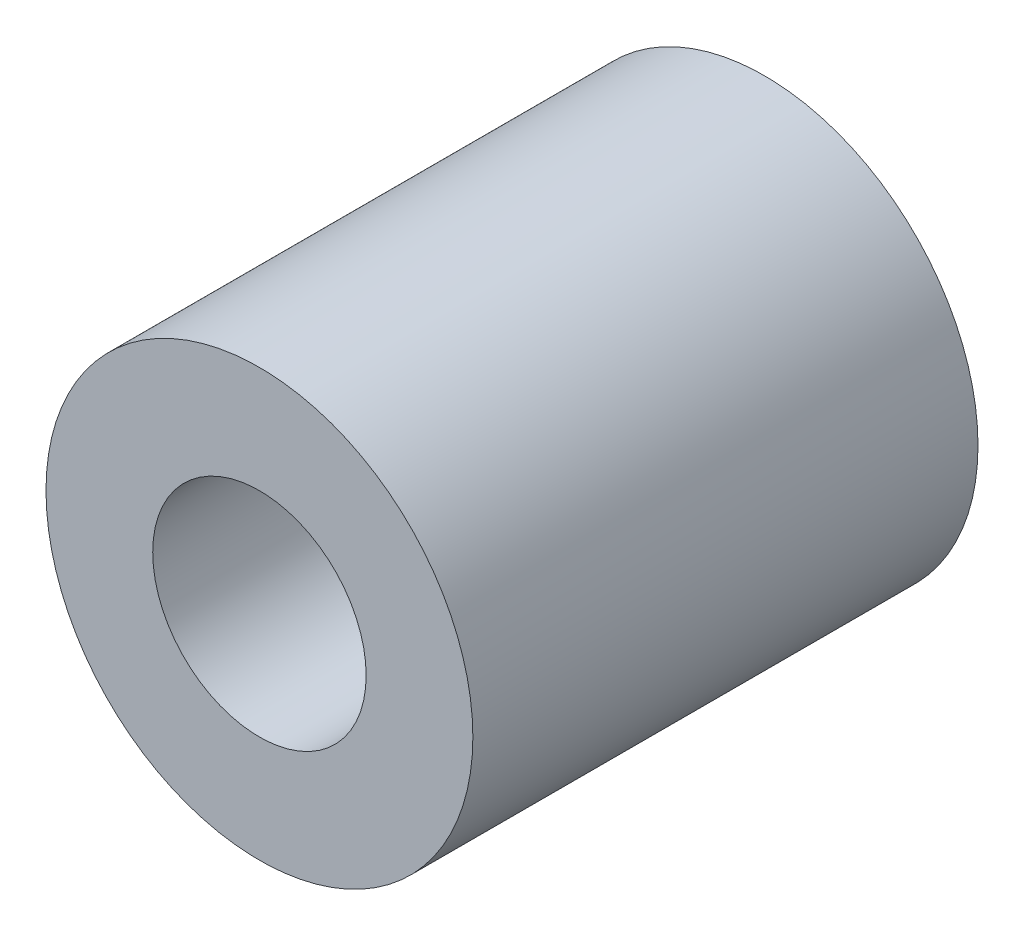
ISO-10303-21;
HEADER;
FILE_DESCRIPTION(('STEP AP214'),'2;1');
FILE_NAME('part.step','',(''),(''),'','','');
FILE_SCHEMA(('AUTOMOTIVE_DESIGN { 1 0 10303 214 1 1 1 1 }'));
ENDSEC;
DATA;
#1=APPLICATION_CONTEXT('core data for automotive mechanical design processes');
#2=APPLICATION_PROTOCOL_DEFINITION('international standard','automotive_design',2000,#1);
#3=PRODUCT_CONTEXT('',#1,'mechanical');
#4=PRODUCT('Part','Part','',(#3));
#5=PRODUCT_RELATED_PRODUCT_CATEGORY('part','',(#4));
#6=PRODUCT_DEFINITION_FORMATION('','',#4);
#7=PRODUCT_DEFINITION_CONTEXT('part definition',#1,'design');
#8=PRODUCT_DEFINITION('design','',#6,#7);
#9=PRODUCT_DEFINITION_SHAPE('','',#8);
#10=(LENGTH_UNIT() NAMED_UNIT(*) SI_UNIT(.MILLI.,.METRE.));
#11=(NAMED_UNIT(*) PLANE_ANGLE_UNIT() SI_UNIT($,.RADIAN.));
#12=(NAMED_UNIT(*) SI_UNIT($,.STERADIAN.) SOLID_ANGLE_UNIT());
#13=UNCERTAINTY_MEASURE_WITH_UNIT(LENGTH_MEASURE(1.E-05),#10,'distance_accuracy_value','');
#14=(GEOMETRIC_REPRESENTATION_CONTEXT(3) GLOBAL_UNCERTAINTY_ASSIGNED_CONTEXT((#13)) GLOBAL_UNIT_ASSIGNED_CONTEXT((#10,
#11,#12)) REPRESENTATION_CONTEXT('',''));
#15=CARTESIAN_POINT('',(0.,0.,0.));
#16=DIRECTION('',(0.,0.,1.));
#17=DIRECTION('',(1.,0.,0.));
#18=AXIS2_PLACEMENT_3D('',#15,#16,#17);
#19=CARTESIAN_POINT('',(0.,0.,10.65));
#20=DIRECTION('',(0.,0.,1.));
#21=DIRECTION('',(1.,0.,0.));
#22=AXIS2_PLACEMENT_3D('',#19,#20,#21);
#23=PLANE('',#22);
#24=CARTESIAN_POINT('',(0.,0.,10.65));
#25=DIRECTION('',(0.,0.,1.));
#26=DIRECTION('',(1.,0.,0.));
#27=AXIS2_PLACEMENT_3D('',#24,#25,#26);
#28=CIRCLE('',#27,4.5);
#29=CARTESIAN_POINT('',(4.5,0.,10.65));
#30=VERTEX_POINT('',#29);
#31=EDGE_CURVE('E10',#30,#30,#28,.T.);
#32=ORIENTED_EDGE('',*,*,#31,.T.);
#33=EDGE_LOOP('',(#32));
#34=FACE_BOUND('',#33,.T.);
#35=CARTESIAN_POINT('',(0.,0.,10.65));
#36=DIRECTION('',(0.,0.,1.));
#37=DIRECTION('',(1.,0.,0.));
#38=AXIS2_PLACEMENT_3D('',#35,#36,#37);
#39=CIRCLE('',#38,2.25);
#40=CARTESIAN_POINT('',(2.25,0.,10.65));
#41=VERTEX_POINT('',#40);
#42=EDGE_CURVE('E43',#41,#41,#39,.T.);
#43=ORIENTED_EDGE('',*,*,#42,.F.);
#44=EDGE_LOOP('',(#43));
#45=FACE_BOUND('',#44,.T.);
#46=ADVANCED_FACE('F32',(#34,#45),#23,.T.);
#47=CARTESIAN_POINT('',(0.,0.,0.));
#48=DIRECTION('',(0.,0.,1.));
#49=DIRECTION('',(1.,0.,0.));
#50=AXIS2_PLACEMENT_3D('',#47,#48,#49);
#51=PLANE('',#50);
#52=CARTESIAN_POINT('',(0.,0.,0.));
#53=DIRECTION('',(0.,0.,1.));
#54=DIRECTION('',(1.,0.,0.));
#55=AXIS2_PLACEMENT_3D('',#52,#53,#54);
#56=CIRCLE('',#55,4.5);
#57=CARTESIAN_POINT('',(4.5,0.,0.));
#58=VERTEX_POINT('',#57);
#59=EDGE_CURVE('E36',#58,#58,#56,.T.);
#60=ORIENTED_EDGE('',*,*,#59,.F.);
#61=EDGE_LOOP('',(#60));
#62=FACE_BOUND('',#61,.T.);
#63=CARTESIAN_POINT('',(0.,0.,0.));
#64=DIRECTION('',(0.,0.,1.));
#65=DIRECTION('',(1.,0.,0.));
#66=AXIS2_PLACEMENT_3D('',#63,#64,#65);
#67=CIRCLE('',#66,2.25);
#68=CARTESIAN_POINT('',(2.25,0.,0.));
#69=VERTEX_POINT('',#68);
#70=EDGE_CURVE('E45',#69,#69,#67,.T.);
#71=ORIENTED_EDGE('',*,*,#70,.T.);
#72=EDGE_LOOP('',(#71));
#73=FACE_BOUND('',#72,.T.);
#74=ADVANCED_FACE('F55',(#62,#73),#51,.F.);
#75=CARTESIAN_POINT('',(0.,0.,10.65));
#76=DIRECTION('',(0.,0.,-1.));
#77=DIRECTION('',(-1.,0.,0.));
#78=AXIS2_PLACEMENT_3D('',#75,#76,#77);
#79=CYLINDRICAL_SURFACE('',#78,4.5);
#80=ORIENTED_EDGE('',*,*,#31,.F.);
#81=EDGE_LOOP('',(#80));
#82=FACE_BOUND('',#81,.T.);
#83=ORIENTED_EDGE('',*,*,#59,.T.);
#84=EDGE_LOOP('',(#83));
#85=FACE_BOUND('',#84,.T.);
#86=ADVANCED_FACE('F34',(#82,#85),#79,.T.);
#87=CARTESIAN_POINT('',(0.,0.,10.65));
#88=DIRECTION('',(0.,0.,-1.));
#89=DIRECTION('',(-1.,0.,0.));
#90=AXIS2_PLACEMENT_3D('',#87,#88,#89);
#91=CYLINDRICAL_SURFACE('',#90,2.25);
#92=ORIENTED_EDGE('',*,*,#42,.T.);
#93=EDGE_LOOP('',(#92));
#94=FACE_BOUND('',#93,.T.);
#95=ORIENTED_EDGE('',*,*,#70,.F.);
#96=EDGE_LOOP('',(#95));
#97=FACE_BOUND('',#96,.T.);
#98=ADVANCED_FACE('F51',(#94,#97),#91,.F.);
#99=CLOSED_SHELL('',(#46,#74,#86,#98));
#100=MANIFOLD_SOLID_BREP('B2',#99);
#101=ADVANCED_BREP_SHAPE_REPRESENTATION('',(#18,#100),#14);
#102=SHAPE_DEFINITION_REPRESENTATION(#9,#101);
ENDSEC;
END-ISO-10303-21;
